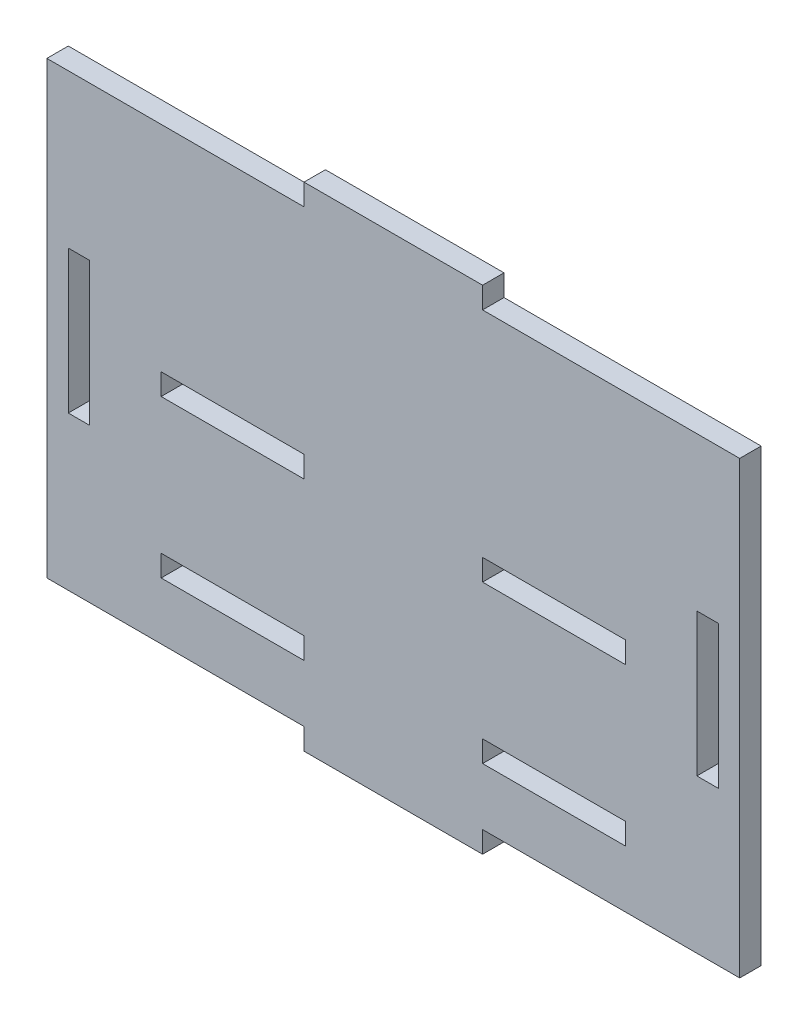
ISO-10303-21;
HEADER;
FILE_DESCRIPTION(('STEP AP214'),'2;1');
FILE_NAME('part.step','',(''),(''),'','','');
FILE_SCHEMA(('AUTOMOTIVE_DESIGN { 1 0 10303 214 1 1 1 1 }'));
ENDSEC;
DATA;
#1=APPLICATION_CONTEXT('core data for automotive mechanical design processes');
#2=APPLICATION_PROTOCOL_DEFINITION('international standard','automotive_design',2000,#1);
#3=PRODUCT_CONTEXT('',#1,'mechanical');
#4=PRODUCT('Part','Part','',(#3));
#5=PRODUCT_RELATED_PRODUCT_CATEGORY('part','',(#4));
#6=PRODUCT_DEFINITION_FORMATION('','',#4);
#7=PRODUCT_DEFINITION_CONTEXT('part definition',#1,'design');
#8=PRODUCT_DEFINITION('design','',#6,#7);
#9=PRODUCT_DEFINITION_SHAPE('','',#8);
#10=(LENGTH_UNIT() NAMED_UNIT(*) SI_UNIT(.MILLI.,.METRE.));
#11=(NAMED_UNIT(*) PLANE_ANGLE_UNIT() SI_UNIT($,.RADIAN.));
#12=(NAMED_UNIT(*) SI_UNIT($,.STERADIAN.) SOLID_ANGLE_UNIT());
#13=UNCERTAINTY_MEASURE_WITH_UNIT(LENGTH_MEASURE(1.E-05),#10,'distance_accuracy_value','');
#14=(GEOMETRIC_REPRESENTATION_CONTEXT(3) GLOBAL_UNCERTAINTY_ASSIGNED_CONTEXT((#13)) GLOBAL_UNIT_ASSIGNED_CONTEXT((#10,
#11,#12)) REPRESENTATION_CONTEXT('',''));
#15=CARTESIAN_POINT('',(0.,0.,0.));
#16=DIRECTION('',(0.,0.,1.));
#17=DIRECTION('',(1.,0.,0.));
#18=AXIS2_PLACEMENT_3D('',#15,#16,#17);
#19=CARTESIAN_POINT('',(-42.5,-31.5,3.));
#20=DIRECTION('',(0.,1.,0.));
#21=DIRECTION('',(0.,0.,1.));
#22=AXIS2_PLACEMENT_3D('',#19,#20,#21);
#23=PLANE('',#22);
#24=DIRECTION('',(0.,0.,1.));
#25=VECTOR('',#24,1.);
#26=CARTESIAN_POINT('',(12.5,-31.5,-25.1793566240283));
#27=LINE('',#26,#25);
#28=CARTESIAN_POINT('',(12.5,-31.5,0.));
#29=VERTEX_POINT('',#28);
#30=CARTESIAN_POINT('',(12.5,-31.5,3.));
#31=VERTEX_POINT('',#30);
#32=EDGE_CURVE('E57',#29,#31,#27,.T.);
#33=ORIENTED_EDGE('',*,*,#32,.F.);
#34=DIRECTION('',(1.,0.,0.));
#35=VECTOR('',#34,1.);
#36=CARTESIAN_POINT('',(-42.5,-31.5,0.));
#37=LINE('',#36,#35);
#38=CARTESIAN_POINT('',(48.5,-31.5,0.));
#39=VERTEX_POINT('',#38);
#40=EDGE_CURVE('E334',#29,#39,#37,.T.);
#41=ORIENTED_EDGE('',*,*,#40,.T.);
#42=DIRECTION('',(0.,0.,1.));
#43=VECTOR('',#42,1.);
#44=CARTESIAN_POINT('',(48.5,-31.5,-63.285069329187));
#45=LINE('',#44,#43);
#46=CARTESIAN_POINT('',(48.5,-31.5,3.));
#47=VERTEX_POINT('',#46);
#48=EDGE_CURVE('E266',#39,#47,#45,.T.);
#49=ORIENTED_EDGE('',*,*,#48,.T.);
#50=DIRECTION('',(1.,0.,0.));
#51=VECTOR('',#50,1.);
#52=CARTESIAN_POINT('',(-42.5,-31.5,3.));
#53=LINE('',#52,#51);
#54=EDGE_CURVE('E42',#31,#47,#53,.T.);
#55=ORIENTED_EDGE('',*,*,#54,.F.);
#56=EDGE_LOOP('',(#33,#41,#49,#55));
#57=FACE_BOUND('',#56,.T.);
#58=ADVANCED_FACE('F33',(#57),#23,.F.);
#59=CARTESIAN_POINT('',(-42.5,31.5,3.));
#60=DIRECTION('',(0.,-1.,0.));
#61=DIRECTION('',(0.,0.,-1.));
#62=AXIS2_PLACEMENT_3D('',#59,#60,#61);
#63=PLANE('',#62);
#64=DIRECTION('',(0.,0.,1.));
#65=VECTOR('',#64,1.);
#66=CARTESIAN_POINT('',(-12.5,31.5,-25.1793566240283));
#67=LINE('',#66,#65);
#68=CARTESIAN_POINT('',(-12.5,31.5,0.));
#69=VERTEX_POINT('',#68);
#70=CARTESIAN_POINT('',(-12.5,31.5,3.));
#71=VERTEX_POINT('',#70);
#72=EDGE_CURVE('E323',#69,#71,#67,.T.);
#73=ORIENTED_EDGE('',*,*,#72,.F.);
#74=DIRECTION('',(-1.,0.,0.));
#75=VECTOR('',#74,1.);
#76=CARTESIAN_POINT('',(-42.5,31.5,0.));
#77=LINE('',#76,#75);
#78=CARTESIAN_POINT('',(-48.5,31.5,0.));
#79=VERTEX_POINT('',#78);
#80=EDGE_CURVE('E343',#69,#79,#77,.T.);
#81=ORIENTED_EDGE('',*,*,#80,.T.);
#82=DIRECTION('',(0.,0.,1.));
#83=VECTOR('',#82,1.);
#84=CARTESIAN_POINT('',(-48.5,31.5,-63.285069329187));
#85=LINE('',#84,#83);
#86=CARTESIAN_POINT('',(-48.5,31.5,3.));
#87=VERTEX_POINT('',#86);
#88=EDGE_CURVE('E439',#79,#87,#85,.T.);
#89=ORIENTED_EDGE('',*,*,#88,.T.);
#90=DIRECTION('',(-1.,0.,0.));
#91=VECTOR('',#90,1.);
#92=CARTESIAN_POINT('',(-42.5,31.5,3.));
#93=LINE('',#92,#91);
#94=EDGE_CURVE('E362',#71,#87,#93,.T.);
#95=ORIENTED_EDGE('',*,*,#94,.F.);
#96=EDGE_LOOP('',(#73,#81,#89,#95));
#97=FACE_BOUND('',#96,.T.);
#98=ADVANCED_FACE('F606',(#97),#63,.F.);
#99=CARTESIAN_POINT('',(42.5,31.5,3.));
#100=DIRECTION('',(-1.,0.,0.));
#101=DIRECTION('',(0.,-1.,0.));
#102=AXIS2_PLACEMENT_3D('',#99,#100,#101);
#103=PLANE('',#102);
#104=DIRECTION('',(0.,1.,0.));
#105=VECTOR('',#104,1.);
#106=CARTESIAN_POINT('',(42.5,31.5,0.));
#107=LINE('',#106,#105);
#108=CARTESIAN_POINT('',(42.5,-9.99999999999999,0.));
#109=VERTEX_POINT('',#108);
#110=CARTESIAN_POINT('',(42.5,9.99999999999999,0.));
#111=VERTEX_POINT('',#110);
#112=EDGE_CURVE('E347',#109,#111,#107,.T.);
#113=ORIENTED_EDGE('',*,*,#112,.T.);
#114=DIRECTION('',(0.,0.,1.));
#115=VECTOR('',#114,1.);
#116=CARTESIAN_POINT('',(42.5,9.99999999999999,-63.285069329187));
#117=LINE('',#116,#115);
#118=CARTESIAN_POINT('',(42.5,9.99999999999999,3.));
#119=VERTEX_POINT('',#118);
#120=EDGE_CURVE('E386',#111,#119,#117,.T.);
#121=ORIENTED_EDGE('',*,*,#120,.T.);
#122=DIRECTION('',(0.,1.,0.));
#123=VECTOR('',#122,1.);
#124=CARTESIAN_POINT('',(42.5,31.5,3.));
#125=LINE('',#124,#123);
#126=CARTESIAN_POINT('',(42.5,-9.99999999999999,3.));
#127=VERTEX_POINT('',#126);
#128=EDGE_CURVE('E333',#127,#119,#125,.T.);
#129=ORIENTED_EDGE('',*,*,#128,.F.);
#130=DIRECTION('',(0.,0.,1.));
#131=VECTOR('',#130,1.);
#132=CARTESIAN_POINT('',(42.5,-9.99999999999999,-63.285069329187));
#133=LINE('',#132,#131);
#134=EDGE_CURVE('E409',#109,#127,#133,.T.);
#135=ORIENTED_EDGE('',*,*,#134,.F.);
#136=EDGE_LOOP('',(#113,#121,#129,#135));
#137=FACE_BOUND('',#136,.T.);
#138=ADVANCED_FACE('F35',(#137),#103,.F.);
#139=CARTESIAN_POINT('',(48.5,31.5,0.));
#140=VERTEX_POINT('',#139);
#141=CARTESIAN_POINT('',(12.5,31.5,0.));
#142=VERTEX_POINT('',#141);
#143=EDGE_CURVE('E340',#140,#142,#77,.T.);
#144=ORIENTED_EDGE('',*,*,#143,.T.);
#145=DIRECTION('',(0.,0.,1.));
#146=VECTOR('',#145,1.);
#147=CARTESIAN_POINT('',(12.5,31.5,-25.1793566240283));
#148=LINE('',#147,#146);
#149=CARTESIAN_POINT('',(12.5,31.5,3.));
#150=VERTEX_POINT('',#149);
#151=EDGE_CURVE('E319',#142,#150,#148,.T.);
#152=ORIENTED_EDGE('',*,*,#151,.T.);
#153=CARTESIAN_POINT('',(48.5,31.5,3.));
#154=VERTEX_POINT('',#153);
#155=EDGE_CURVE('E356',#154,#150,#93,.T.);
#156=ORIENTED_EDGE('',*,*,#155,.F.);
#157=DIRECTION('',(0.,0.,1.));
#158=VECTOR('',#157,1.);
#159=CARTESIAN_POINT('',(48.5,31.5,-63.285069329187));
#160=LINE('',#159,#158);
#161=EDGE_CURVE('E405',#140,#154,#160,.T.);
#162=ORIENTED_EDGE('',*,*,#161,.F.);
#163=EDGE_LOOP('',(#144,#152,#156,#162));
#164=FACE_BOUND('',#163,.T.);
#165=ADVANCED_FACE('F613',(#164),#63,.F.);
#166=CARTESIAN_POINT('',(-42.5,31.5,3.));
#167=DIRECTION('',(1.,0.,0.));
#168=DIRECTION('',(0.,1.,0.));
#169=AXIS2_PLACEMENT_3D('',#166,#167,#168);
#170=PLANE('',#169);
#171=DIRECTION('',(0.,-1.,0.));
#172=VECTOR('',#171,1.);
#173=CARTESIAN_POINT('',(-42.5,31.5,3.));
#174=LINE('',#173,#172);
#175=CARTESIAN_POINT('',(-42.5,9.99999999999999,3.));
#176=VERTEX_POINT('',#175);
#177=CARTESIAN_POINT('',(-42.5,-9.99999999999999,3.));
#178=VERTEX_POINT('',#177);
#179=EDGE_CURVE('E271',#176,#178,#174,.T.);
#180=ORIENTED_EDGE('',*,*,#179,.F.);
#181=DIRECTION('',(0.,0.,1.));
#182=VECTOR('',#181,1.);
#183=CARTESIAN_POINT('',(-42.5,9.99999999999999,-63.285069329187));
#184=LINE('',#183,#182);
#185=CARTESIAN_POINT('',(-42.5,9.99999999999999,0.));
#186=VERTEX_POINT('',#185);
#187=EDGE_CURVE('E421',#186,#176,#184,.T.);
#188=ORIENTED_EDGE('',*,*,#187,.F.);
#189=DIRECTION('',(0.,-1.,0.));
#190=VECTOR('',#189,1.);
#191=CARTESIAN_POINT('',(-42.5,31.5,0.));
#192=LINE('',#191,#190);
#193=CARTESIAN_POINT('',(-42.5,-9.99999999999999,0.));
#194=VERTEX_POINT('',#193);
#195=EDGE_CURVE('E338',#186,#194,#192,.T.);
#196=ORIENTED_EDGE('',*,*,#195,.T.);
#197=DIRECTION('',(0.,0.,1.));
#198=VECTOR('',#197,1.);
#199=CARTESIAN_POINT('',(-42.5,-9.99999999999999,-63.285069329187));
#200=LINE('',#199,#198);
#201=EDGE_CURVE('E446',#194,#178,#200,.T.);
#202=ORIENTED_EDGE('',*,*,#201,.T.);
#203=EDGE_LOOP('',(#180,#188,#196,#202));
#204=FACE_BOUND('',#203,.T.);
#205=ADVANCED_FACE('F617',(#204),#170,.F.);
#206=CARTESIAN_POINT('',(-48.5,-31.5,0.));
#207=VERTEX_POINT('',#206);
#208=CARTESIAN_POINT('',(-12.5,-31.5,0.));
#209=VERTEX_POINT('',#208);
#210=EDGE_CURVE('E330',#207,#209,#37,.T.);
#211=ORIENTED_EDGE('',*,*,#210,.T.);
#212=DIRECTION('',(0.,0.,1.));
#213=VECTOR('',#212,1.);
#214=CARTESIAN_POINT('',(-12.5,-31.5,-25.1793566240283));
#215=LINE('',#214,#213);
#216=CARTESIAN_POINT('',(-12.5,-31.5,3.));
#217=VERTEX_POINT('',#216);
#218=EDGE_CURVE('E50',#209,#217,#215,.T.);
#219=ORIENTED_EDGE('',*,*,#218,.T.);
#220=CARTESIAN_POINT('',(-48.5,-31.5,3.));
#221=VERTEX_POINT('',#220);
#222=EDGE_CURVE('E11',#221,#217,#53,.T.);
#223=ORIENTED_EDGE('',*,*,#222,.F.);
#224=DIRECTION('',(0.,0.,1.));
#225=VECTOR('',#224,1.);
#226=CARTESIAN_POINT('',(-48.5,-31.5,-63.285069329187));
#227=LINE('',#226,#225);
#228=EDGE_CURVE('E448',#207,#221,#227,.T.);
#229=ORIENTED_EDGE('',*,*,#228,.F.);
#230=EDGE_LOOP('',(#211,#219,#223,#229));
#231=FACE_BOUND('',#230,.T.);
#232=ADVANCED_FACE('F608',(#231),#23,.F.);
#233=CARTESIAN_POINT('',(0.,0.,3.));
#234=DIRECTION('',(0.,0.,1.));
#235=DIRECTION('',(1.,0.,0.));
#236=AXIS2_PLACEMENT_3D('',#233,#234,#235);
#237=PLANE('',#236);
#238=ORIENTED_EDGE('',*,*,#128,.T.);
#239=DIRECTION('',(1.,0.,0.));
#240=VECTOR('',#239,1.);
#241=CARTESIAN_POINT('',(45.5,10.,3.));
#242=LINE('',#241,#240);
#243=CARTESIAN_POINT('',(45.5,10.,3.));
#244=VERTEX_POINT('',#243);
#245=EDGE_CURVE('E376',#119,#244,#242,.T.);
#246=ORIENTED_EDGE('',*,*,#245,.T.);
#247=DIRECTION('',(0.,-1.,0.));
#248=VECTOR('',#247,1.);
#249=CARTESIAN_POINT('',(45.5,-9.99999999999999,3.));
#250=LINE('',#249,#248);
#251=CARTESIAN_POINT('',(45.5,-9.99999999999999,3.));
#252=VERTEX_POINT('',#251);
#253=EDGE_CURVE('E390',#244,#252,#250,.T.);
#254=ORIENTED_EDGE('',*,*,#253,.T.);
#255=DIRECTION('',(-1.,0.,0.));
#256=VECTOR('',#255,1.);
#257=CARTESIAN_POINT('',(42.5,-9.99999999999999,3.));
#258=LINE('',#257,#256);
#259=EDGE_CURVE('E378',#252,#127,#258,.T.);
#260=ORIENTED_EDGE('',*,*,#259,.T.);
#261=EDGE_LOOP('',(#238,#246,#254,#260));
#262=FACE_BOUND('',#261,.T.);
#263=DIRECTION('',(1.,0.,0.));
#264=VECTOR('',#263,1.);
#265=CARTESIAN_POINT('',(-45.5,10.,3.));
#266=LINE('',#265,#264);
#267=CARTESIAN_POINT('',(-45.5,10.,3.));
#268=VERTEX_POINT('',#267);
#269=EDGE_CURVE('E436',#268,#176,#266,.T.);
#270=ORIENTED_EDGE('',*,*,#269,.T.);
#271=ORIENTED_EDGE('',*,*,#179,.T.);
#272=DIRECTION('',(-1.,0.,0.));
#273=VECTOR('',#272,1.);
#274=CARTESIAN_POINT('',(-42.5,-9.99999999999999,3.));
#275=LINE('',#274,#273);
#276=CARTESIAN_POINT('',(-45.5,-9.99999999999999,3.));
#277=VERTEX_POINT('',#276);
#278=EDGE_CURVE('E430',#178,#277,#275,.T.);
#279=ORIENTED_EDGE('',*,*,#278,.T.);
#280=DIRECTION('',(0.,1.,0.));
#281=VECTOR('',#280,1.);
#282=CARTESIAN_POINT('',(-45.5,-9.99999999999999,3.));
#283=LINE('',#282,#281);
#284=EDGE_CURVE('E433',#277,#268,#283,.T.);
#285=ORIENTED_EDGE('',*,*,#284,.T.);
#286=EDGE_LOOP('',(#270,#271,#279,#285));
#287=FACE_BOUND('',#286,.T.);
#288=DIRECTION('',(0.,-1.,0.));
#289=VECTOR('',#288,1.);
#290=CARTESIAN_POINT('',(12.5,-20.5,3.));
#291=LINE('',#290,#289);
#292=CARTESIAN_POINT('',(12.5,-20.5,3.));
#293=VERTEX_POINT('',#292);
#294=CARTESIAN_POINT('',(12.5,-23.5,3.));
#295=VERTEX_POINT('',#294);
#296=EDGE_CURVE('E428',#293,#295,#291,.T.);
#297=ORIENTED_EDGE('',*,*,#296,.F.);
#298=DIRECTION('',(-1.,0.,0.));
#299=VECTOR('',#298,1.);
#300=CARTESIAN_POINT('',(32.5,-20.5,3.));
#301=LINE('',#300,#299);
#302=CARTESIAN_POINT('',(32.5,-20.5,3.));
#303=VERTEX_POINT('',#302);
#304=EDGE_CURVE('E456',#303,#293,#301,.T.);
#305=ORIENTED_EDGE('',*,*,#304,.F.);
#306=DIRECTION('',(0.,1.,0.));
#307=VECTOR('',#306,1.);
#308=CARTESIAN_POINT('',(32.5,-20.5,3.));
#309=LINE('',#308,#307);
#310=CARTESIAN_POINT('',(32.5,-23.5,3.));
#311=VERTEX_POINT('',#310);
#312=EDGE_CURVE('E470',#311,#303,#309,.T.);
#313=ORIENTED_EDGE('',*,*,#312,.F.);
#314=DIRECTION('',(1.,0.,0.));
#315=VECTOR('',#314,1.);
#316=CARTESIAN_POINT('',(32.5,-23.5,3.));
#317=LINE('',#316,#315);
#318=EDGE_CURVE('E467',#295,#311,#317,.T.);
#319=ORIENTED_EDGE('',*,*,#318,.F.);
#320=EDGE_LOOP('',(#297,#305,#313,#319));
#321=FACE_BOUND('',#320,.T.);
#322=DIRECTION('',(0.,-1.,0.));
#323=VECTOR('',#322,1.);
#324=CARTESIAN_POINT('',(-32.5,-20.5,3.));
#325=LINE('',#324,#323);
#326=CARTESIAN_POINT('',(-32.5,-20.5,3.));
#327=VERTEX_POINT('',#326);
#328=CARTESIAN_POINT('',(-32.5,-23.5,3.));
#329=VERTEX_POINT('',#328);
#330=EDGE_CURVE('E477',#327,#329,#325,.T.);
#331=ORIENTED_EDGE('',*,*,#330,.F.);
#332=DIRECTION('',(-1.,0.,0.));
#333=VECTOR('',#332,1.);
#334=CARTESIAN_POINT('',(-12.5,-20.5,3.));
#335=LINE('',#334,#333);
#336=CARTESIAN_POINT('',(-12.5,-20.5,3.));
#337=VERTEX_POINT('',#336);
#338=EDGE_CURVE('E488',#337,#327,#335,.T.);
#339=ORIENTED_EDGE('',*,*,#338,.F.);
#340=DIRECTION('',(0.,1.,0.));
#341=VECTOR('',#340,1.);
#342=CARTESIAN_POINT('',(-12.5,-20.5,3.));
#343=LINE('',#342,#341);
#344=CARTESIAN_POINT('',(-12.5,-23.5,3.));
#345=VERTEX_POINT('',#344);
#346=EDGE_CURVE('E502',#345,#337,#343,.T.);
#347=ORIENTED_EDGE('',*,*,#346,.F.);
#348=DIRECTION('',(1.,0.,0.));
#349=VECTOR('',#348,1.);
#350=CARTESIAN_POINT('',(-12.5,-23.5,3.));
#351=LINE('',#350,#349);
#352=EDGE_CURVE('E499',#329,#345,#351,.T.);
#353=ORIENTED_EDGE('',*,*,#352,.F.);
#354=EDGE_LOOP('',(#331,#339,#347,#353));
#355=FACE_BOUND('',#354,.T.);
#356=DIRECTION('',(0.,-1.,0.));
#357=VECTOR('',#356,1.);
#358=CARTESIAN_POINT('',(12.5,1.50000000000002,3.));
#359=LINE('',#358,#357);
#360=CARTESIAN_POINT('',(12.5,1.50000000000002,3.));
#361=VERTEX_POINT('',#360);
#362=CARTESIAN_POINT('',(12.5,-1.49999999999999,3.));
#363=VERTEX_POINT('',#362);
#364=EDGE_CURVE('E509',#361,#363,#359,.T.);
#365=ORIENTED_EDGE('',*,*,#364,.F.);
#366=DIRECTION('',(-1.,0.,0.));
#367=VECTOR('',#366,1.);
#368=CARTESIAN_POINT('',(32.5,1.50000000000002,3.));
#369=LINE('',#368,#367);
#370=CARTESIAN_POINT('',(32.5,1.50000000000002,3.));
#371=VERTEX_POINT('',#370);
#372=EDGE_CURVE('E520',#371,#361,#369,.T.);
#373=ORIENTED_EDGE('',*,*,#372,.F.);
#374=DIRECTION('',(0.,1.,0.));
#375=VECTOR('',#374,1.);
#376=CARTESIAN_POINT('',(32.5,1.50000000000002,3.));
#377=LINE('',#376,#375);
#378=CARTESIAN_POINT('',(32.5,-1.49999999999998,3.));
#379=VERTEX_POINT('',#378);
#380=EDGE_CURVE('E534',#379,#371,#377,.T.);
#381=ORIENTED_EDGE('',*,*,#380,.F.);
#382=DIRECTION('',(1.,0.,0.));
#383=VECTOR('',#382,1.);
#384=CARTESIAN_POINT('',(32.5,-1.49999999999998,3.));
#385=LINE('',#384,#383);
#386=EDGE_CURVE('E531',#363,#379,#385,.T.);
#387=ORIENTED_EDGE('',*,*,#386,.F.);
#388=EDGE_LOOP('',(#365,#373,#381,#387));
#389=FACE_BOUND('',#388,.T.);
#390=DIRECTION('',(0.,1.,0.));
#391=VECTOR('',#390,1.);
#392=CARTESIAN_POINT('',(-12.5,1.50000000000001,3.));
#393=LINE('',#392,#391);
#394=CARTESIAN_POINT('',(-12.5,-1.49999999999999,3.));
#395=VERTEX_POINT('',#394);
#396=CARTESIAN_POINT('',(-12.5,1.50000000000001,3.));
#397=VERTEX_POINT('',#396);
#398=EDGE_CURVE('E541',#395,#397,#393,.T.);
#399=ORIENTED_EDGE('',*,*,#398,.F.);
#400=DIRECTION('',(1.,0.,0.));
#401=VECTOR('',#400,1.);
#402=CARTESIAN_POINT('',(-32.5,-1.5,3.));
#403=LINE('',#402,#401);
#404=CARTESIAN_POINT('',(-32.5,-1.5,3.));
#405=VERTEX_POINT('',#404);
#406=EDGE_CURVE('E552',#405,#395,#403,.T.);
#407=ORIENTED_EDGE('',*,*,#406,.F.);
#408=DIRECTION('',(0.,-1.,0.));
#409=VECTOR('',#408,1.);
#410=CARTESIAN_POINT('',(-32.5,1.50000000000001,3.));
#411=LINE('',#410,#409);
#412=CARTESIAN_POINT('',(-32.5,1.50000000000001,3.));
#413=VERTEX_POINT('',#412);
#414=EDGE_CURVE('E566',#413,#405,#411,.T.);
#415=ORIENTED_EDGE('',*,*,#414,.F.);
#416=DIRECTION('',(-1.,0.,0.));
#417=VECTOR('',#416,1.);
#418=CARTESIAN_POINT('',(-32.5,1.50000000000001,3.));
#419=LINE('',#418,#417);
#420=EDGE_CURVE('E563',#397,#413,#419,.T.);
#421=ORIENTED_EDGE('',*,*,#420,.F.);
#422=EDGE_LOOP('',(#399,#407,#415,#421));
#423=FACE_BOUND('',#422,.T.);
#424=ORIENTED_EDGE('',*,*,#222,.T.);
#425=DIRECTION('',(0.,-1.,0.));
#426=VECTOR('',#425,1.);
#427=CARTESIAN_POINT('',(-12.5,-34.5,3.));
#428=LINE('',#427,#426);
#429=CARTESIAN_POINT('',(-12.5,-34.5,3.));
#430=VERTEX_POINT('',#429);
#431=EDGE_CURVE('E286',#217,#430,#428,.T.);
#432=ORIENTED_EDGE('',*,*,#431,.T.);
#433=DIRECTION('',(1.,0.,0.));
#434=VECTOR('',#433,1.);
#435=CARTESIAN_POINT('',(-12.5,-34.5,3.));
#436=LINE('',#435,#434);
#437=CARTESIAN_POINT('',(12.5,-34.5,3.));
#438=VERTEX_POINT('',#437);
#439=EDGE_CURVE('E281',#430,#438,#436,.T.);
#440=ORIENTED_EDGE('',*,*,#439,.T.);
#441=DIRECTION('',(0.,1.,0.));
#442=VECTOR('',#441,1.);
#443=CARTESIAN_POINT('',(12.5,-34.5,3.));
#444=LINE('',#443,#442);
#445=EDGE_CURVE('E278',#438,#31,#444,.T.);
#446=ORIENTED_EDGE('',*,*,#445,.T.);
#447=ORIENTED_EDGE('',*,*,#54,.T.);
#448=DIRECTION('',(0.,1.,0.));
#449=VECTOR('',#448,1.);
#450=CARTESIAN_POINT('',(48.5,31.5,3.));
#451=LINE('',#450,#449);
#452=EDGE_CURVE('E401',#47,#154,#451,.T.);
#453=ORIENTED_EDGE('',*,*,#452,.T.);
#454=ORIENTED_EDGE('',*,*,#155,.T.);
#455=DIRECTION('',(0.,1.,0.));
#456=VECTOR('',#455,1.);
#457=CARTESIAN_POINT('',(12.5,34.5,3.));
#458=LINE('',#457,#456);
#459=CARTESIAN_POINT('',(12.5,34.5,3.));
#460=VERTEX_POINT('',#459);
#461=EDGE_CURVE('E293',#150,#460,#458,.T.);
#462=ORIENTED_EDGE('',*,*,#461,.T.);
#463=DIRECTION('',(-1.,0.,0.));
#464=VECTOR('',#463,1.);
#465=CARTESIAN_POINT('',(-12.5,34.5,3.));
#466=LINE('',#465,#464);
#467=CARTESIAN_POINT('',(-12.5,34.5,3.));
#468=VERTEX_POINT('',#467);
#469=EDGE_CURVE('E310',#460,#468,#466,.T.);
#470=ORIENTED_EDGE('',*,*,#469,.T.);
#471=DIRECTION('',(0.,-1.,0.));
#472=VECTOR('',#471,1.);
#473=CARTESIAN_POINT('',(-12.5,34.5,3.));
#474=LINE('',#473,#472);
#475=EDGE_CURVE('E313',#468,#71,#474,.T.);
#476=ORIENTED_EDGE('',*,*,#475,.T.);
#477=ORIENTED_EDGE('',*,*,#94,.T.);
#478=DIRECTION('',(0.,-1.,0.));
#479=VECTOR('',#478,1.);
#480=CARTESIAN_POINT('',(-48.5,31.5,3.));
#481=LINE('',#480,#479);
#482=EDGE_CURVE('E416',#87,#221,#481,.T.);
#483=ORIENTED_EDGE('',*,*,#482,.T.);
#484=EDGE_LOOP('',(#424,#432,#440,#446,#447,#453,#454,#462,#470,#476,#477,#483));
#485=FACE_BOUND('',#484,.T.);
#486=ADVANCED_FACE('F283',(#262,#287,#321,#355,#389,#423,#485),#237,.T.);
#487=CARTESIAN_POINT('',(0.,0.,0.));
#488=DIRECTION('',(0.,0.,1.));
#489=DIRECTION('',(1.,0.,0.));
#490=AXIS2_PLACEMENT_3D('',#487,#488,#489);
#491=PLANE('',#490);
#492=ORIENTED_EDGE('',*,*,#143,.F.);
#493=DIRECTION('',(0.,-1.,0.));
#494=VECTOR('',#493,1.);
#495=CARTESIAN_POINT('',(48.5,31.5,0.));
#496=LINE('',#495,#494);
#497=EDGE_CURVE('E1037',#140,#39,#496,.T.);
#498=ORIENTED_EDGE('',*,*,#497,.T.);
#499=ORIENTED_EDGE('',*,*,#40,.F.);
#500=DIRECTION('',(0.,-1.,0.));
#501=VECTOR('',#500,1.);
#502=CARTESIAN_POINT('',(12.5,-34.5,0.));
#503=LINE('',#502,#501);
#504=CARTESIAN_POINT('',(12.5,-34.5,0.));
#505=VERTEX_POINT('',#504);
#506=EDGE_CURVE('E280',#29,#505,#503,.T.);
#507=ORIENTED_EDGE('',*,*,#506,.T.);
#508=DIRECTION('',(-1.,0.,0.));
#509=VECTOR('',#508,1.);
#510=CARTESIAN_POINT('',(-12.5,-34.5,0.));
#511=LINE('',#510,#509);
#512=CARTESIAN_POINT('',(-12.5,-34.5,0.));
#513=VERTEX_POINT('',#512);
#514=EDGE_CURVE('E294',#505,#513,#511,.T.);
#515=ORIENTED_EDGE('',*,*,#514,.T.);
#516=DIRECTION('',(0.,1.,0.));
#517=VECTOR('',#516,1.);
#518=CARTESIAN_POINT('',(-12.5,-34.5,0.));
#519=LINE('',#518,#517);
#520=EDGE_CURVE('E297',#513,#209,#519,.T.);
#521=ORIENTED_EDGE('',*,*,#520,.T.);
#522=ORIENTED_EDGE('',*,*,#210,.F.);
#523=DIRECTION('',(0.,1.,0.));
#524=VECTOR('',#523,1.);
#525=CARTESIAN_POINT('',(-48.5,31.5,0.));
#526=LINE('',#525,#524);
#527=EDGE_CURVE('E417',#207,#79,#526,.T.);
#528=ORIENTED_EDGE('',*,*,#527,.T.);
#529=ORIENTED_EDGE('',*,*,#80,.F.);
#530=DIRECTION('',(0.,1.,0.));
#531=VECTOR('',#530,1.);
#532=CARTESIAN_POINT('',(-12.5,34.5,0.));
#533=LINE('',#532,#531);
#534=CARTESIAN_POINT('',(-12.5,34.5,0.));
#535=VERTEX_POINT('',#534);
#536=EDGE_CURVE('E322',#69,#535,#533,.T.);
#537=ORIENTED_EDGE('',*,*,#536,.T.);
#538=DIRECTION('',(1.,0.,0.));
#539=VECTOR('',#538,1.);
#540=CARTESIAN_POINT('',(-12.5,34.5,0.));
#541=LINE('',#540,#539);
#542=CARTESIAN_POINT('',(12.5,34.5,0.));
#543=VERTEX_POINT('',#542);
#544=EDGE_CURVE('E391',#535,#543,#541,.T.);
#545=ORIENTED_EDGE('',*,*,#544,.T.);
#546=DIRECTION('',(0.,-1.,0.));
#547=VECTOR('',#546,1.);
#548=CARTESIAN_POINT('',(12.5,34.5,0.));
#549=LINE('',#548,#547);
#550=EDGE_CURVE('E394',#543,#142,#549,.T.);
#551=ORIENTED_EDGE('',*,*,#550,.T.);
#552=EDGE_LOOP('',(#492,#498,#499,#507,#515,#521,#522,#528,#529,#537,#545,#551));
#553=FACE_BOUND('',#552,.T.);
#554=ORIENTED_EDGE('',*,*,#195,.F.);
#555=DIRECTION('',(-1.,0.,0.));
#556=VECTOR('',#555,1.);
#557=CARTESIAN_POINT('',(-45.5,10.,0.));
#558=LINE('',#557,#556);
#559=CARTESIAN_POINT('',(-45.5,10.,0.));
#560=VERTEX_POINT('',#559);
#561=EDGE_CURVE('E426',#186,#560,#558,.T.);
#562=ORIENTED_EDGE('',*,*,#561,.T.);
#563=DIRECTION('',(0.,-1.,0.));
#564=VECTOR('',#563,1.);
#565=CARTESIAN_POINT('',(-45.5,-9.99999999999999,0.));
#566=LINE('',#565,#564);
#567=CARTESIAN_POINT('',(-45.5,-9.99999999999999,0.));
#568=VERTEX_POINT('',#567);
#569=EDGE_CURVE('E424',#560,#568,#566,.T.);
#570=ORIENTED_EDGE('',*,*,#569,.T.);
#571=DIRECTION('',(1.,0.,0.));
#572=VECTOR('',#571,1.);
#573=CARTESIAN_POINT('',(-42.5,-9.99999999999999,0.));
#574=LINE('',#573,#572);
#575=EDGE_CURVE('E420',#568,#194,#574,.T.);
#576=ORIENTED_EDGE('',*,*,#575,.T.);
#577=EDGE_LOOP('',(#554,#562,#570,#576));
#578=FACE_BOUND('',#577,.T.);
#579=DIRECTION('',(-1.,0.,0.));
#580=VECTOR('',#579,1.);
#581=CARTESIAN_POINT('',(32.5,-20.5,0.));
#582=LINE('',#581,#580);
#583=CARTESIAN_POINT('',(32.5,-20.5,0.));
#584=VERTEX_POINT('',#583);
#585=CARTESIAN_POINT('',(12.5,-20.5,0.));
#586=VERTEX_POINT('',#585);
#587=EDGE_CURVE('E462',#584,#586,#582,.T.);
#588=ORIENTED_EDGE('',*,*,#587,.T.);
#589=DIRECTION('',(0.,-1.,0.));
#590=VECTOR('',#589,1.);
#591=CARTESIAN_POINT('',(12.5,-20.5,0.));
#592=LINE('',#591,#590);
#593=CARTESIAN_POINT('',(12.5,-23.5,0.));
#594=VERTEX_POINT('',#593);
#595=EDGE_CURVE('E452',#586,#594,#592,.T.);
#596=ORIENTED_EDGE('',*,*,#595,.T.);
#597=DIRECTION('',(1.,0.,0.));
#598=VECTOR('',#597,1.);
#599=CARTESIAN_POINT('',(32.5,-23.5,0.));
#600=LINE('',#599,#598);
#601=CARTESIAN_POINT('',(32.5,-23.5,0.));
#602=VERTEX_POINT('',#601);
#603=EDGE_CURVE('E455',#594,#602,#600,.T.);
#604=ORIENTED_EDGE('',*,*,#603,.T.);
#605=DIRECTION('',(0.,1.,0.));
#606=VECTOR('',#605,1.);
#607=CARTESIAN_POINT('',(32.5,-20.5,0.));
#608=LINE('',#607,#606);
#609=EDGE_CURVE('E459',#602,#584,#608,.T.);
#610=ORIENTED_EDGE('',*,*,#609,.T.);
#611=EDGE_LOOP('',(#588,#596,#604,#610));
#612=FACE_BOUND('',#611,.T.);
#613=DIRECTION('',(-1.,0.,0.));
#614=VECTOR('',#613,1.);
#615=CARTESIAN_POINT('',(-12.5,-20.5,0.));
#616=LINE('',#615,#614);
#617=CARTESIAN_POINT('',(-12.5,-20.5,0.));
#618=VERTEX_POINT('',#617);
#619=CARTESIAN_POINT('',(-32.5,-20.5,0.));
#620=VERTEX_POINT('',#619);
#621=EDGE_CURVE('E494',#618,#620,#616,.T.);
#622=ORIENTED_EDGE('',*,*,#621,.T.);
#623=DIRECTION('',(0.,-1.,0.));
#624=VECTOR('',#623,1.);
#625=CARTESIAN_POINT('',(-32.5,-20.5,0.));
#626=LINE('',#625,#624);
#627=CARTESIAN_POINT('',(-32.5,-23.5,0.));
#628=VERTEX_POINT('',#627);
#629=EDGE_CURVE('E484',#620,#628,#626,.T.);
#630=ORIENTED_EDGE('',*,*,#629,.T.);
#631=DIRECTION('',(1.,0.,0.));
#632=VECTOR('',#631,1.);
#633=CARTESIAN_POINT('',(-12.5,-23.5,0.));
#634=LINE('',#633,#632);
#635=CARTESIAN_POINT('',(-12.5,-23.5,0.));
#636=VERTEX_POINT('',#635);
#637=EDGE_CURVE('E487',#628,#636,#634,.T.);
#638=ORIENTED_EDGE('',*,*,#637,.T.);
#639=DIRECTION('',(0.,1.,0.));
#640=VECTOR('',#639,1.);
#641=CARTESIAN_POINT('',(-12.5,-20.5,0.));
#642=LINE('',#641,#640);
#643=EDGE_CURVE('E491',#636,#618,#642,.T.);
#644=ORIENTED_EDGE('',*,*,#643,.T.);
#645=EDGE_LOOP('',(#622,#630,#638,#644));
#646=FACE_BOUND('',#645,.T.);
#647=DIRECTION('',(-1.,0.,0.));
#648=VECTOR('',#647,1.);
#649=CARTESIAN_POINT('',(32.5,1.50000000000002,0.));
#650=LINE('',#649,#648);
#651=CARTESIAN_POINT('',(32.5,1.50000000000002,0.));
#652=VERTEX_POINT('',#651);
#653=CARTESIAN_POINT('',(12.5,1.50000000000002,0.));
#654=VERTEX_POINT('',#653);
#655=EDGE_CURVE('E526',#652,#654,#650,.T.);
#656=ORIENTED_EDGE('',*,*,#655,.T.);
#657=DIRECTION('',(0.,-1.,0.));
#658=VECTOR('',#657,1.);
#659=CARTESIAN_POINT('',(12.5,1.50000000000002,0.));
#660=LINE('',#659,#658);
#661=CARTESIAN_POINT('',(12.5,-1.49999999999999,0.));
#662=VERTEX_POINT('',#661);
#663=EDGE_CURVE('E516',#654,#662,#660,.T.);
#664=ORIENTED_EDGE('',*,*,#663,.T.);
#665=DIRECTION('',(1.,0.,0.));
#666=VECTOR('',#665,1.);
#667=CARTESIAN_POINT('',(32.5,-1.49999999999998,0.));
#668=LINE('',#667,#666);
#669=CARTESIAN_POINT('',(32.5,-1.49999999999998,0.));
#670=VERTEX_POINT('',#669);
#671=EDGE_CURVE('E519',#662,#670,#668,.T.);
#672=ORIENTED_EDGE('',*,*,#671,.T.);
#673=DIRECTION('',(0.,1.,0.));
#674=VECTOR('',#673,1.);
#675=CARTESIAN_POINT('',(32.5,1.50000000000002,0.));
#676=LINE('',#675,#674);
#677=EDGE_CURVE('E523',#670,#652,#676,.T.);
#678=ORIENTED_EDGE('',*,*,#677,.T.);
#679=EDGE_LOOP('',(#656,#664,#672,#678));
#680=FACE_BOUND('',#679,.T.);
#681=DIRECTION('',(1.,0.,0.));
#682=VECTOR('',#681,1.);
#683=CARTESIAN_POINT('',(-32.5,-1.5,0.));
#684=LINE('',#683,#682);
#685=CARTESIAN_POINT('',(-32.5,-1.5,0.));
#686=VERTEX_POINT('',#685);
#687=CARTESIAN_POINT('',(-12.5,-1.49999999999999,0.));
#688=VERTEX_POINT('',#687);
#689=EDGE_CURVE('E558',#686,#688,#684,.T.);
#690=ORIENTED_EDGE('',*,*,#689,.T.);
#691=DIRECTION('',(0.,1.,0.));
#692=VECTOR('',#691,1.);
#693=CARTESIAN_POINT('',(-12.5,1.50000000000001,0.));
#694=LINE('',#693,#692);
#695=CARTESIAN_POINT('',(-12.5,1.50000000000001,0.));
#696=VERTEX_POINT('',#695);
#697=EDGE_CURVE('E548',#688,#696,#694,.T.);
#698=ORIENTED_EDGE('',*,*,#697,.T.);
#699=DIRECTION('',(-1.,0.,0.));
#700=VECTOR('',#699,1.);
#701=CARTESIAN_POINT('',(-32.5,1.50000000000001,0.));
#702=LINE('',#701,#700);
#703=CARTESIAN_POINT('',(-32.5,1.50000000000001,0.));
#704=VERTEX_POINT('',#703);
#705=EDGE_CURVE('E551',#696,#704,#702,.T.);
#706=ORIENTED_EDGE('',*,*,#705,.T.);
#707=DIRECTION('',(0.,-1.,0.));
#708=VECTOR('',#707,1.);
#709=CARTESIAN_POINT('',(-32.5,1.50000000000001,0.));
#710=LINE('',#709,#708);
#711=EDGE_CURVE('E555',#704,#686,#710,.T.);
#712=ORIENTED_EDGE('',*,*,#711,.T.);
#713=EDGE_LOOP('',(#690,#698,#706,#712));
#714=FACE_BOUND('',#713,.T.);
#715=ORIENTED_EDGE('',*,*,#112,.F.);
#716=DIRECTION('',(1.,0.,0.));
#717=VECTOR('',#716,1.);
#718=CARTESIAN_POINT('',(42.5,-9.99999999999999,0.));
#719=LINE('',#718,#717);
#720=CARTESIAN_POINT('',(45.5,-9.99999999999999,0.));
#721=VERTEX_POINT('',#720);
#722=EDGE_CURVE('E404',#109,#721,#719,.T.);
#723=ORIENTED_EDGE('',*,*,#722,.T.);
#724=DIRECTION('',(0.,1.,0.));
#725=VECTOR('',#724,1.);
#726=CARTESIAN_POINT('',(45.5,-9.99999999999999,0.));
#727=LINE('',#726,#725);
#728=CARTESIAN_POINT('',(45.5,10.,0.));
#729=VERTEX_POINT('',#728);
#730=EDGE_CURVE('E414',#721,#729,#727,.T.);
#731=ORIENTED_EDGE('',*,*,#730,.T.);
#732=DIRECTION('',(-1.,0.,0.));
#733=VECTOR('',#732,1.);
#734=CARTESIAN_POINT('',(45.5,10.,0.));
#735=LINE('',#734,#733);
#736=EDGE_CURVE('E397',#729,#111,#735,.T.);
#737=ORIENTED_EDGE('',*,*,#736,.T.);
#738=EDGE_LOOP('',(#715,#723,#731,#737));
#739=FACE_BOUND('',#738,.T.);
#740=ADVANCED_FACE('F591',(#553,#578,#612,#646,#680,#714,#739),#491,.F.);
#741=CARTESIAN_POINT('',(-12.5,1.50000000000001,0.));
#742=DIRECTION('',(1.,0.,0.));
#743=DIRECTION('',(0.,0.,-1.));
#744=AXIS2_PLACEMENT_3D('',#741,#742,#743);
#745=PLANE('',#744);
#746=ORIENTED_EDGE('',*,*,#398,.T.);
#747=DIRECTION('',(0.,0.,1.));
#748=VECTOR('',#747,1.);
#749=CARTESIAN_POINT('',(-12.5,1.50000000000001,0.));
#750=LINE('',#749,#748);
#751=EDGE_CURVE('E561',#696,#397,#750,.T.);
#752=ORIENTED_EDGE('',*,*,#751,.F.);
#753=ORIENTED_EDGE('',*,*,#697,.F.);
#754=DIRECTION('',(0.,0.,1.));
#755=VECTOR('',#754,1.);
#756=CARTESIAN_POINT('',(-12.5,-1.49999999999999,0.));
#757=LINE('',#756,#755);
#758=EDGE_CURVE('E350',#688,#395,#757,.T.);
#759=ORIENTED_EDGE('',*,*,#758,.T.);
#760=EDGE_LOOP('',(#746,#752,#753,#759));
#761=FACE_BOUND('',#760,.T.);
#762=ADVANCED_FACE('F593',(#761),#745,.F.);
#763=CARTESIAN_POINT('',(-32.5,-1.5,0.));
#764=DIRECTION('',(0.,-1.,0.));
#765=DIRECTION('',(1.,0.,0.));
#766=AXIS2_PLACEMENT_3D('',#763,#764,#765);
#767=PLANE('',#766);
#768=ORIENTED_EDGE('',*,*,#406,.T.);
#769=ORIENTED_EDGE('',*,*,#758,.F.);
#770=ORIENTED_EDGE('',*,*,#689,.F.);
#771=DIRECTION('',(0.,0.,1.));
#772=VECTOR('',#771,1.);
#773=CARTESIAN_POINT('',(-32.5,-1.5,0.));
#774=LINE('',#773,#772);
#775=EDGE_CURVE('E572',#686,#405,#774,.T.);
#776=ORIENTED_EDGE('',*,*,#775,.T.);
#777=EDGE_LOOP('',(#768,#769,#770,#776));
#778=FACE_BOUND('',#777,.T.);
#779=ADVANCED_FACE('F595',(#778),#767,.F.);
#780=CARTESIAN_POINT('',(-32.5,1.50000000000001,0.));
#781=DIRECTION('',(-1.,0.,0.));
#782=DIRECTION('',(0.,0.,1.));
#783=AXIS2_PLACEMENT_3D('',#780,#781,#782);
#784=PLANE('',#783);
#785=ORIENTED_EDGE('',*,*,#414,.T.);
#786=ORIENTED_EDGE('',*,*,#775,.F.);
#787=ORIENTED_EDGE('',*,*,#711,.F.);
#788=DIRECTION('',(0.,0.,1.));
#789=VECTOR('',#788,1.);
#790=CARTESIAN_POINT('',(-32.5,1.50000000000001,0.));
#791=LINE('',#790,#789);
#792=EDGE_CURVE('E574',#704,#413,#791,.T.);
#793=ORIENTED_EDGE('',*,*,#792,.T.);
#794=EDGE_LOOP('',(#785,#786,#787,#793));
#795=FACE_BOUND('',#794,.T.);
#796=ADVANCED_FACE('F588',(#795),#784,.F.);
#797=CARTESIAN_POINT('',(-32.5,1.50000000000001,0.));
#798=DIRECTION('',(0.,1.,0.));
#799=DIRECTION('',(0.,0.,1.));
#800=AXIS2_PLACEMENT_3D('',#797,#798,#799);
#801=PLANE('',#800);
#802=ORIENTED_EDGE('',*,*,#420,.T.);
#803=ORIENTED_EDGE('',*,*,#792,.F.);
#804=ORIENTED_EDGE('',*,*,#705,.F.);
#805=ORIENTED_EDGE('',*,*,#751,.T.);
#806=EDGE_LOOP('',(#802,#803,#804,#805));
#807=FACE_BOUND('',#806,.T.);
#808=ADVANCED_FACE('F579',(#807),#801,.F.);
#809=CARTESIAN_POINT('',(12.5,1.50000000000002,0.));
#810=DIRECTION('',(-1.,0.,0.));
#811=DIRECTION('',(0.,0.,1.));
#812=AXIS2_PLACEMENT_3D('',#809,#810,#811);
#813=PLANE('',#812);
#814=ORIENTED_EDGE('',*,*,#364,.T.);
#815=DIRECTION('',(0.,0.,1.));
#816=VECTOR('',#815,1.);
#817=CARTESIAN_POINT('',(12.5,-1.49999999999999,0.));
#818=LINE('',#817,#816);
#819=EDGE_CURVE('E529',#662,#363,#818,.T.);
#820=ORIENTED_EDGE('',*,*,#819,.F.);
#821=ORIENTED_EDGE('',*,*,#663,.F.);
#822=DIRECTION('',(0.,0.,1.));
#823=VECTOR('',#822,1.);
#824=CARTESIAN_POINT('',(12.5,1.50000000000002,0.));
#825=LINE('',#824,#823);
#826=EDGE_CURVE('E539',#654,#361,#825,.T.);
#827=ORIENTED_EDGE('',*,*,#826,.T.);
#828=EDGE_LOOP('',(#814,#820,#821,#827));
#829=FACE_BOUND('',#828,.T.);
#830=ADVANCED_FACE('F726',(#829),#813,.F.);
#831=CARTESIAN_POINT('',(32.5,1.50000000000002,0.));
#832=DIRECTION('',(0.,1.,0.));
#833=DIRECTION('',(-1.,0.,0.));
#834=AXIS2_PLACEMENT_3D('',#831,#832,#833);
#835=PLANE('',#834);
#836=ORIENTED_EDGE('',*,*,#372,.T.);
#837=ORIENTED_EDGE('',*,*,#826,.F.);
#838=ORIENTED_EDGE('',*,*,#655,.F.);
#839=DIRECTION('',(0.,0.,1.));
#840=VECTOR('',#839,1.);
#841=CARTESIAN_POINT('',(32.5,1.50000000000002,0.));
#842=LINE('',#841,#840);
#843=EDGE_CURVE('E542',#652,#371,#842,.T.);
#844=ORIENTED_EDGE('',*,*,#843,.T.);
#845=EDGE_LOOP('',(#836,#837,#838,#844));
#846=FACE_BOUND('',#845,.T.);
#847=ADVANCED_FACE('F722',(#846),#835,.F.);
#848=CARTESIAN_POINT('',(32.5,1.50000000000002,0.));
#849=DIRECTION('',(1.,0.,0.));
#850=DIRECTION('',(0.,0.,-1.));
#851=AXIS2_PLACEMENT_3D('',#848,#849,#850);
#852=PLANE('',#851);
#853=ORIENTED_EDGE('',*,*,#380,.T.);
#854=ORIENTED_EDGE('',*,*,#843,.F.);
#855=ORIENTED_EDGE('',*,*,#677,.F.);
#856=DIRECTION('',(0.,0.,1.));
#857=VECTOR('',#856,1.);
#858=CARTESIAN_POINT('',(32.5,-1.49999999999998,0.));
#859=LINE('',#858,#857);
#860=EDGE_CURVE('E544',#670,#379,#859,.T.);
#861=ORIENTED_EDGE('',*,*,#860,.T.);
#862=EDGE_LOOP('',(#853,#854,#855,#861));
#863=FACE_BOUND('',#862,.T.);
#864=ADVANCED_FACE('F725',(#863),#852,.F.);
#865=CARTESIAN_POINT('',(32.5,-1.49999999999998,0.));
#866=DIRECTION('',(0.,-1.,0.));
#867=DIRECTION('',(1.,0.,0.));
#868=AXIS2_PLACEMENT_3D('',#865,#866,#867);
#869=PLANE('',#868);
#870=ORIENTED_EDGE('',*,*,#386,.T.);
#871=ORIENTED_EDGE('',*,*,#860,.F.);
#872=ORIENTED_EDGE('',*,*,#671,.F.);
#873=ORIENTED_EDGE('',*,*,#819,.T.);
#874=EDGE_LOOP('',(#870,#871,#872,#873));
#875=FACE_BOUND('',#874,.T.);
#876=ADVANCED_FACE('F720',(#875),#869,.F.);
#877=CARTESIAN_POINT('',(-32.5,-20.5,0.));
#878=DIRECTION('',(-1.,0.,0.));
#879=DIRECTION('',(0.,0.,1.));
#880=AXIS2_PLACEMENT_3D('',#877,#878,#879);
#881=PLANE('',#880);
#882=ORIENTED_EDGE('',*,*,#330,.T.);
#883=DIRECTION('',(0.,0.,1.));
#884=VECTOR('',#883,1.);
#885=CARTESIAN_POINT('',(-32.5,-23.5,0.));
#886=LINE('',#885,#884);
#887=EDGE_CURVE('E497',#628,#329,#886,.T.);
#888=ORIENTED_EDGE('',*,*,#887,.F.);
#889=ORIENTED_EDGE('',*,*,#629,.F.);
#890=DIRECTION('',(0.,0.,1.));
#891=VECTOR('',#890,1.);
#892=CARTESIAN_POINT('',(-32.5,-20.5,0.));
#893=LINE('',#892,#891);
#894=EDGE_CURVE('E507',#620,#327,#893,.T.);
#895=ORIENTED_EDGE('',*,*,#894,.T.);
#896=EDGE_LOOP('',(#882,#888,#889,#895));
#897=FACE_BOUND('',#896,.T.);
#898=ADVANCED_FACE('F710',(#897),#881,.F.);
#899=CARTESIAN_POINT('',(-12.5,-20.5,0.));
#900=DIRECTION('',(0.,1.,0.));
#901=DIRECTION('',(-1.,0.,0.));
#902=AXIS2_PLACEMENT_3D('',#899,#900,#901);
#903=PLANE('',#902);
#904=ORIENTED_EDGE('',*,*,#338,.T.);
#905=ORIENTED_EDGE('',*,*,#894,.F.);
#906=ORIENTED_EDGE('',*,*,#621,.F.);
#907=DIRECTION('',(0.,0.,1.));
#908=VECTOR('',#907,1.);
#909=CARTESIAN_POINT('',(-12.5,-20.5,0.));
#910=LINE('',#909,#908);
#911=EDGE_CURVE('E510',#618,#337,#910,.T.);
#912=ORIENTED_EDGE('',*,*,#911,.T.);
#913=EDGE_LOOP('',(#904,#905,#906,#912));
#914=FACE_BOUND('',#913,.T.);
#915=ADVANCED_FACE('F706',(#914),#903,.F.);
#916=CARTESIAN_POINT('',(-12.5,-20.5,0.));
#917=DIRECTION('',(1.,0.,0.));
#918=DIRECTION('',(0.,1.,0.));
#919=AXIS2_PLACEMENT_3D('',#916,#917,#918);
#920=PLANE('',#919);
#921=ORIENTED_EDGE('',*,*,#346,.T.);
#922=ORIENTED_EDGE('',*,*,#911,.F.);
#923=ORIENTED_EDGE('',*,*,#643,.F.);
#924=DIRECTION('',(0.,0.,1.));
#925=VECTOR('',#924,1.);
#926=CARTESIAN_POINT('',(-12.5,-23.5,0.));
#927=LINE('',#926,#925);
#928=EDGE_CURVE('E512',#636,#345,#927,.T.);
#929=ORIENTED_EDGE('',*,*,#928,.T.);
#930=EDGE_LOOP('',(#921,#922,#923,#929));
#931=FACE_BOUND('',#930,.T.);
#932=ADVANCED_FACE('F709',(#931),#920,.F.);
#933=CARTESIAN_POINT('',(-12.5,-23.5,0.));
#934=DIRECTION('',(0.,-1.,0.));
#935=DIRECTION('',(1.,0.,0.));
#936=AXIS2_PLACEMENT_3D('',#933,#934,#935);
#937=PLANE('',#936);
#938=ORIENTED_EDGE('',*,*,#352,.T.);
#939=ORIENTED_EDGE('',*,*,#928,.F.);
#940=ORIENTED_EDGE('',*,*,#637,.F.);
#941=ORIENTED_EDGE('',*,*,#887,.T.);
#942=EDGE_LOOP('',(#938,#939,#940,#941));
#943=FACE_BOUND('',#942,.T.);
#944=ADVANCED_FACE('F704',(#943),#937,.F.);
#945=CARTESIAN_POINT('',(12.5,-20.5,0.));
#946=DIRECTION('',(-1.,0.,0.));
#947=DIRECTION('',(0.,-1.,0.));
#948=AXIS2_PLACEMENT_3D('',#945,#946,#947);
#949=PLANE('',#948);
#950=ORIENTED_EDGE('',*,*,#296,.T.);
#951=DIRECTION('',(0.,0.,1.));
#952=VECTOR('',#951,1.);
#953=CARTESIAN_POINT('',(12.5,-23.5,0.));
#954=LINE('',#953,#952);
#955=EDGE_CURVE('E465',#594,#295,#954,.T.);
#956=ORIENTED_EDGE('',*,*,#955,.F.);
#957=ORIENTED_EDGE('',*,*,#595,.F.);
#958=DIRECTION('',(0.,0.,1.));
#959=VECTOR('',#958,1.);
#960=CARTESIAN_POINT('',(12.5,-20.5,0.));
#961=LINE('',#960,#959);
#962=EDGE_CURVE('E475',#586,#293,#961,.T.);
#963=ORIENTED_EDGE('',*,*,#962,.T.);
#964=EDGE_LOOP('',(#950,#956,#957,#963));
#965=FACE_BOUND('',#964,.T.);
#966=ADVANCED_FACE('F694',(#965),#949,.F.);
#967=CARTESIAN_POINT('',(32.5,-20.5,0.));
#968=DIRECTION('',(0.,1.,0.));
#969=DIRECTION('',(0.,0.,1.));
#970=AXIS2_PLACEMENT_3D('',#967,#968,#969);
#971=PLANE('',#970);
#972=ORIENTED_EDGE('',*,*,#304,.T.);
#973=ORIENTED_EDGE('',*,*,#962,.F.);
#974=ORIENTED_EDGE('',*,*,#587,.F.);
#975=DIRECTION('',(0.,0.,1.));
#976=VECTOR('',#975,1.);
#977=CARTESIAN_POINT('',(32.5,-20.5,0.));
#978=LINE('',#977,#976);
#979=EDGE_CURVE('E478',#584,#303,#978,.T.);
#980=ORIENTED_EDGE('',*,*,#979,.T.);
#981=EDGE_LOOP('',(#972,#973,#974,#980));
#982=FACE_BOUND('',#981,.T.);
#983=ADVANCED_FACE('F690',(#982),#971,.F.);
#984=CARTESIAN_POINT('',(32.5,-20.5,0.));
#985=DIRECTION('',(1.,0.,0.));
#986=DIRECTION('',(0.,0.,-1.));
#987=AXIS2_PLACEMENT_3D('',#984,#985,#986);
#988=PLANE('',#987);
#989=ORIENTED_EDGE('',*,*,#312,.T.);
#990=ORIENTED_EDGE('',*,*,#979,.F.);
#991=ORIENTED_EDGE('',*,*,#609,.F.);
#992=DIRECTION('',(0.,0.,1.));
#993=VECTOR('',#992,1.);
#994=CARTESIAN_POINT('',(32.5,-23.5,0.));
#995=LINE('',#994,#993);
#996=EDGE_CURVE('E480',#602,#311,#995,.T.);
#997=ORIENTED_EDGE('',*,*,#996,.T.);
#998=EDGE_LOOP('',(#989,#990,#991,#997));
#999=FACE_BOUND('',#998,.T.);
#1000=ADVANCED_FACE('F693',(#999),#988,.F.);
#1001=CARTESIAN_POINT('',(32.5,-23.5,0.));
#1002=DIRECTION('',(0.,-1.,0.));
#1003=DIRECTION('',(0.,0.,-1.));
#1004=AXIS2_PLACEMENT_3D('',#1001,#1002,#1003);
#1005=PLANE('',#1004);
#1006=ORIENTED_EDGE('',*,*,#318,.T.);
#1007=ORIENTED_EDGE('',*,*,#996,.F.);
#1008=ORIENTED_EDGE('',*,*,#603,.F.);
#1009=ORIENTED_EDGE('',*,*,#955,.T.);
#1010=EDGE_LOOP('',(#1006,#1007,#1008,#1009));
#1011=FACE_BOUND('',#1010,.T.);
#1012=ADVANCED_FACE('F678',(#1011),#1005,.F.);
#1013=CARTESIAN_POINT('',(-45.5,10.,-63.285069329187));
#1014=DIRECTION('',(0.,-1.,0.));
#1015=DIRECTION('',(1.,0.,0.));
#1016=AXIS2_PLACEMENT_3D('',#1013,#1014,#1015);
#1017=PLANE('',#1016);
#1018=ORIENTED_EDGE('',*,*,#561,.F.);
#1019=ORIENTED_EDGE('',*,*,#187,.T.);
#1020=ORIENTED_EDGE('',*,*,#269,.F.);
#1021=DIRECTION('',(0.,0.,1.));
#1022=VECTOR('',#1021,1.);
#1023=CARTESIAN_POINT('',(-45.5,10.,-63.285069329187));
#1024=LINE('',#1023,#1022);
#1025=EDGE_CURVE('E442',#560,#268,#1024,.T.);
#1026=ORIENTED_EDGE('',*,*,#1025,.F.);
#1027=EDGE_LOOP('',(#1018,#1019,#1020,#1026));
#1028=FACE_BOUND('',#1027,.T.);
#1029=ADVANCED_FACE('F674',(#1028),#1017,.T.);
#1030=CARTESIAN_POINT('',(-45.5,-9.99999999999999,-63.285069329187));
#1031=DIRECTION('',(1.,0.,0.));
#1032=DIRECTION('',(0.,0.,-1.));
#1033=AXIS2_PLACEMENT_3D('',#1030,#1031,#1032);
#1034=PLANE('',#1033);
#1035=ORIENTED_EDGE('',*,*,#569,.F.);
#1036=ORIENTED_EDGE('',*,*,#1025,.T.);
#1037=ORIENTED_EDGE('',*,*,#284,.F.);
#1038=DIRECTION('',(0.,0.,1.));
#1039=VECTOR('',#1038,1.);
#1040=CARTESIAN_POINT('',(-45.5,-9.99999999999999,-63.285069329187));
#1041=LINE('',#1040,#1039);
#1042=EDGE_CURVE('E444',#568,#277,#1041,.T.);
#1043=ORIENTED_EDGE('',*,*,#1042,.F.);
#1044=EDGE_LOOP('',(#1035,#1036,#1037,#1043));
#1045=FACE_BOUND('',#1044,.T.);
#1046=ADVANCED_FACE('F677',(#1045),#1034,.T.);
#1047=CARTESIAN_POINT('',(-42.5,-9.99999999999999,-63.285069329187));
#1048=DIRECTION('',(0.,1.,0.));
#1049=DIRECTION('',(-1.,0.,0.));
#1050=AXIS2_PLACEMENT_3D('',#1047,#1048,#1049);
#1051=PLANE('',#1050);
#1052=ORIENTED_EDGE('',*,*,#575,.F.);
#1053=ORIENTED_EDGE('',*,*,#1042,.T.);
#1054=ORIENTED_EDGE('',*,*,#278,.F.);
#1055=ORIENTED_EDGE('',*,*,#201,.F.);
#1056=EDGE_LOOP('',(#1052,#1053,#1054,#1055));
#1057=FACE_BOUND('',#1056,.T.);
#1058=ADVANCED_FACE('F682',(#1057),#1051,.T.);
#1059=CARTESIAN_POINT('',(-48.5,31.5,-63.285069329187));
#1060=DIRECTION('',(-1.,0.,0.));
#1061=DIRECTION('',(0.,-1.,0.));
#1062=AXIS2_PLACEMENT_3D('',#1059,#1060,#1061);
#1063=PLANE('',#1062);
#1064=ORIENTED_EDGE('',*,*,#527,.F.);
#1065=ORIENTED_EDGE('',*,*,#228,.T.);
#1066=ORIENTED_EDGE('',*,*,#482,.F.);
#1067=ORIENTED_EDGE('',*,*,#88,.F.);
#1068=EDGE_LOOP('',(#1064,#1065,#1066,#1067));
#1069=FACE_BOUND('',#1068,.T.);
#1070=ADVANCED_FACE('F673',(#1069),#1063,.T.);
#1071=CARTESIAN_POINT('',(45.5,10.,-63.285069329187));
#1072=DIRECTION('',(0.,-1.,0.));
#1073=DIRECTION('',(1.,0.,0.));
#1074=AXIS2_PLACEMENT_3D('',#1071,#1072,#1073);
#1075=PLANE('',#1074);
#1076=ORIENTED_EDGE('',*,*,#736,.F.);
#1077=DIRECTION('',(0.,0.,1.));
#1078=VECTOR('',#1077,1.);
#1079=CARTESIAN_POINT('',(45.5,10.,-63.285069329187));
#1080=LINE('',#1079,#1078);
#1081=EDGE_CURVE('E388',#729,#244,#1080,.T.);
#1082=ORIENTED_EDGE('',*,*,#1081,.T.);
#1083=ORIENTED_EDGE('',*,*,#245,.F.);
#1084=ORIENTED_EDGE('',*,*,#120,.F.);
#1085=EDGE_LOOP('',(#1076,#1082,#1083,#1084));
#1086=FACE_BOUND('',#1085,.T.);
#1087=ADVANCED_FACE('F385',(#1086),#1075,.T.);
#1088=CARTESIAN_POINT('',(48.5,31.5,-63.285069329187));
#1089=DIRECTION('',(1.,0.,0.));
#1090=DIRECTION('',(0.,1.,0.));
#1091=AXIS2_PLACEMENT_3D('',#1088,#1089,#1090);
#1092=PLANE('',#1091);
#1093=ORIENTED_EDGE('',*,*,#497,.F.);
#1094=ORIENTED_EDGE('',*,*,#161,.T.);
#1095=ORIENTED_EDGE('',*,*,#452,.F.);
#1096=ORIENTED_EDGE('',*,*,#48,.F.);
#1097=EDGE_LOOP('',(#1093,#1094,#1095,#1096));
#1098=FACE_BOUND('',#1097,.T.);
#1099=ADVANCED_FACE('F660',(#1098),#1092,.T.);
#1100=CARTESIAN_POINT('',(42.5,-9.99999999999999,-63.285069329187));
#1101=DIRECTION('',(0.,1.,0.));
#1102=DIRECTION('',(-1.,0.,0.));
#1103=AXIS2_PLACEMENT_3D('',#1100,#1101,#1102);
#1104=PLANE('',#1103);
#1105=ORIENTED_EDGE('',*,*,#722,.F.);
#1106=ORIENTED_EDGE('',*,*,#134,.T.);
#1107=ORIENTED_EDGE('',*,*,#259,.F.);
#1108=DIRECTION('',(0.,0.,1.));
#1109=VECTOR('',#1108,1.);
#1110=CARTESIAN_POINT('',(45.5,-9.99999999999999,-63.285069329187));
#1111=LINE('',#1110,#1109);
#1112=EDGE_CURVE('E411',#721,#252,#1111,.T.);
#1113=ORIENTED_EDGE('',*,*,#1112,.F.);
#1114=EDGE_LOOP('',(#1105,#1106,#1107,#1113));
#1115=FACE_BOUND('',#1114,.T.);
#1116=ADVANCED_FACE('F663',(#1115),#1104,.T.);
#1117=CARTESIAN_POINT('',(45.5,-9.99999999999999,-63.285069329187));
#1118=DIRECTION('',(-1.,0.,0.));
#1119=DIRECTION('',(0.,0.,1.));
#1120=AXIS2_PLACEMENT_3D('',#1117,#1118,#1119);
#1121=PLANE('',#1120);
#1122=ORIENTED_EDGE('',*,*,#730,.F.);
#1123=ORIENTED_EDGE('',*,*,#1112,.T.);
#1124=ORIENTED_EDGE('',*,*,#253,.F.);
#1125=ORIENTED_EDGE('',*,*,#1081,.F.);
#1126=EDGE_LOOP('',(#1122,#1123,#1124,#1125));
#1127=FACE_BOUND('',#1126,.T.);
#1128=ADVANCED_FACE('F658',(#1127),#1121,.T.);
#1129=CARTESIAN_POINT('',(12.5,34.5,-25.1793566240283));
#1130=DIRECTION('',(1.,0.,0.));
#1131=DIRECTION('',(0.,0.,-1.));
#1132=AXIS2_PLACEMENT_3D('',#1129,#1130,#1131);
#1133=PLANE('',#1132);
#1134=ORIENTED_EDGE('',*,*,#550,.F.);
#1135=DIRECTION('',(0.,0.,1.));
#1136=VECTOR('',#1135,1.);
#1137=CARTESIAN_POINT('',(12.5,34.5,-25.1793566240283));
#1138=LINE('',#1137,#1136);
#1139=EDGE_CURVE('E1019',#543,#460,#1138,.T.);
#1140=ORIENTED_EDGE('',*,*,#1139,.T.);
#1141=ORIENTED_EDGE('',*,*,#461,.F.);
#1142=ORIENTED_EDGE('',*,*,#151,.F.);
#1143=EDGE_LOOP('',(#1134,#1140,#1141,#1142));
#1144=FACE_BOUND('',#1143,.T.);
#1145=ADVANCED_FACE('F651',(#1144),#1133,.T.);
#1146=CARTESIAN_POINT('',(-12.5,34.5,-25.1793566240283));
#1147=DIRECTION('',(-1.,0.,0.));
#1148=DIRECTION('',(0.,0.,1.));
#1149=AXIS2_PLACEMENT_3D('',#1146,#1147,#1148);
#1150=PLANE('',#1149);
#1151=ORIENTED_EDGE('',*,*,#536,.F.);
#1152=ORIENTED_EDGE('',*,*,#72,.T.);
#1153=ORIENTED_EDGE('',*,*,#475,.F.);
#1154=DIRECTION('',(0.,0.,1.));
#1155=VECTOR('',#1154,1.);
#1156=CARTESIAN_POINT('',(-12.5,34.5,-25.1793566240283));
#1157=LINE('',#1156,#1155);
#1158=EDGE_CURVE('E1023',#535,#468,#1157,.T.);
#1159=ORIENTED_EDGE('',*,*,#1158,.F.);
#1160=EDGE_LOOP('',(#1151,#1152,#1153,#1159));
#1161=FACE_BOUND('',#1160,.T.);
#1162=ADVANCED_FACE('F648',(#1161),#1150,.T.);
#1163=CARTESIAN_POINT('',(-12.5,34.5,-25.1793566240283));
#1164=DIRECTION('',(0.,1.,0.));
#1165=DIRECTION('',(-1.,0.,0.));
#1166=AXIS2_PLACEMENT_3D('',#1163,#1164,#1165);
#1167=PLANE('',#1166);
#1168=ORIENTED_EDGE('',*,*,#544,.F.);
#1169=ORIENTED_EDGE('',*,*,#1158,.T.);
#1170=ORIENTED_EDGE('',*,*,#469,.F.);
#1171=ORIENTED_EDGE('',*,*,#1139,.F.);
#1172=EDGE_LOOP('',(#1168,#1169,#1170,#1171));
#1173=FACE_BOUND('',#1172,.T.);
#1174=ADVANCED_FACE('F645',(#1173),#1167,.T.);
#1175=CARTESIAN_POINT('',(12.5,-34.5,-25.1793566240283));
#1176=DIRECTION('',(1.,0.,0.));
#1177=DIRECTION('',(0.,0.,-1.));
#1178=AXIS2_PLACEMENT_3D('',#1175,#1176,#1177);
#1179=PLANE('',#1178);
#1180=ORIENTED_EDGE('',*,*,#506,.F.);
#1181=ORIENTED_EDGE('',*,*,#32,.T.);
#1182=ORIENTED_EDGE('',*,*,#445,.F.);
#1183=DIRECTION('',(0.,0.,1.));
#1184=VECTOR('',#1183,1.);
#1185=CARTESIAN_POINT('',(12.5,-34.5,-25.1793566240283));
#1186=LINE('',#1185,#1184);
#1187=EDGE_CURVE('E300',#505,#438,#1186,.T.);
#1188=ORIENTED_EDGE('',*,*,#1187,.F.);
#1189=EDGE_LOOP('',(#1180,#1181,#1182,#1188));
#1190=FACE_BOUND('',#1189,.T.);
#1191=ADVANCED_FACE('F276',(#1190),#1179,.T.);
#1192=CARTESIAN_POINT('',(-12.5,-34.5,-25.1793566240283));
#1193=DIRECTION('',(0.,-1.,0.));
#1194=DIRECTION('',(0.,0.,-1.));
#1195=AXIS2_PLACEMENT_3D('',#1192,#1193,#1194);
#1196=PLANE('',#1195);
#1197=ORIENTED_EDGE('',*,*,#514,.F.);
#1198=ORIENTED_EDGE('',*,*,#1187,.T.);
#1199=ORIENTED_EDGE('',*,*,#439,.F.);
#1200=DIRECTION('',(0.,0.,1.));
#1201=VECTOR('',#1200,1.);
#1202=CARTESIAN_POINT('',(-12.5,-34.5,-25.1793566240283));
#1203=LINE('',#1202,#1201);
#1204=EDGE_CURVE('E304',#513,#430,#1203,.T.);
#1205=ORIENTED_EDGE('',*,*,#1204,.F.);
#1206=EDGE_LOOP('',(#1197,#1198,#1199,#1205));
#1207=FACE_BOUND('',#1206,.T.);
#1208=ADVANCED_FACE('F635',(#1207),#1196,.T.);
#1209=CARTESIAN_POINT('',(-12.5,-34.5,-25.1793566240283));
#1210=DIRECTION('',(-1.,0.,0.));
#1211=DIRECTION('',(0.,0.,1.));
#1212=AXIS2_PLACEMENT_3D('',#1209,#1210,#1211);
#1213=PLANE('',#1212);
#1214=ORIENTED_EDGE('',*,*,#520,.F.);
#1215=ORIENTED_EDGE('',*,*,#1204,.T.);
#1216=ORIENTED_EDGE('',*,*,#431,.F.);
#1217=ORIENTED_EDGE('',*,*,#218,.F.);
#1218=EDGE_LOOP('',(#1214,#1215,#1216,#1217));
#1219=FACE_BOUND('',#1218,.T.);
#1220=ADVANCED_FACE('F633',(#1219),#1213,.T.);
#1221=CLOSED_SHELL('',(#58,#98,#138,#165,#205,#232,#486,#740,#762,#779,#796,#808,#830,#847,#864,
#876,#898,#915,#932,#944,#966,#983,#1000,#1012,#1029,#1046,#1058,#1070,#1087,#1099,#1116,#1128,
#1145,#1162,#1174,#1191,#1208,#1220));
#1222=MANIFOLD_SOLID_BREP('B2',#1221);
#1223=ADVANCED_BREP_SHAPE_REPRESENTATION('',(#18,#1222),#14);
#1224=SHAPE_DEFINITION_REPRESENTATION(#9,#1223);
ENDSEC;
END-ISO-10303-21;
